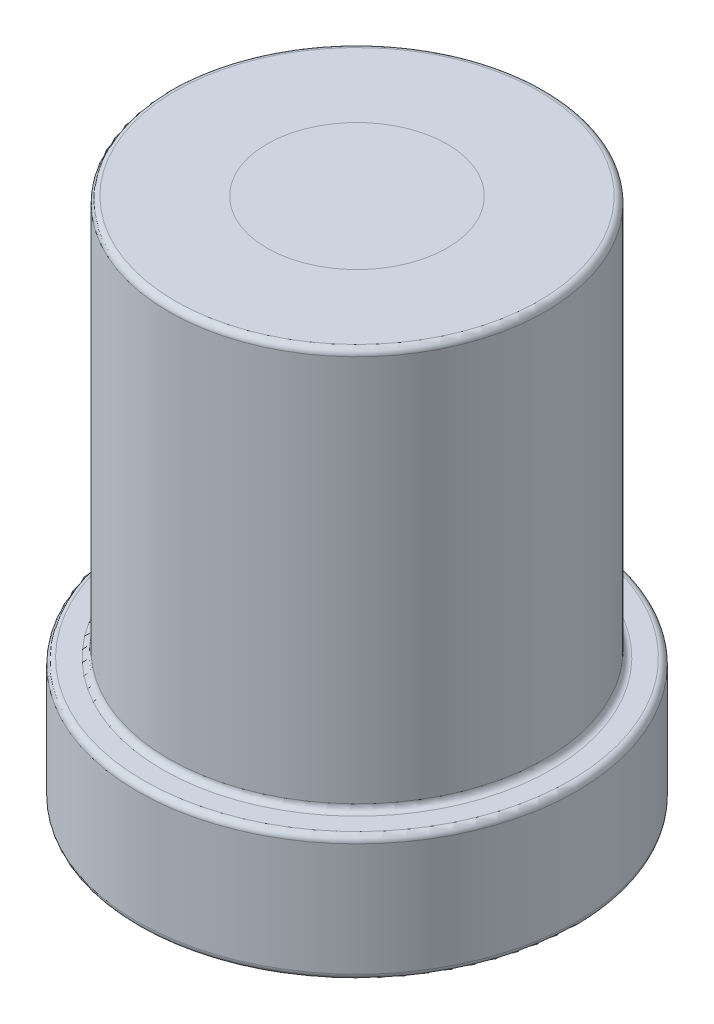
ISO-10303-21;
HEADER;
FILE_DESCRIPTION(('STEP AP214'),'2;1');
FILE_NAME('part.step','',(''),(''),'','','');
FILE_SCHEMA(('AUTOMOTIVE_DESIGN { 1 0 10303 214 1 1 1 1 }'));
ENDSEC;
DATA;
#1=APPLICATION_CONTEXT('core data for automotive mechanical design processes');
#2=APPLICATION_PROTOCOL_DEFINITION('international standard','automotive_design',2000,#1);
#3=PRODUCT_CONTEXT('',#1,'mechanical');
#4=PRODUCT('Part','Part','',(#3));
#5=PRODUCT_RELATED_PRODUCT_CATEGORY('part','',(#4));
#6=PRODUCT_DEFINITION_FORMATION('','',#4);
#7=PRODUCT_DEFINITION_CONTEXT('part definition',#1,'design');
#8=PRODUCT_DEFINITION('design','',#6,#7);
#9=PRODUCT_DEFINITION_SHAPE('','',#8);
#10=(LENGTH_UNIT() NAMED_UNIT(*) SI_UNIT(.MILLI.,.METRE.));
#11=(NAMED_UNIT(*) PLANE_ANGLE_UNIT() SI_UNIT($,.RADIAN.));
#12=(NAMED_UNIT(*) SI_UNIT($,.STERADIAN.) SOLID_ANGLE_UNIT());
#13=UNCERTAINTY_MEASURE_WITH_UNIT(LENGTH_MEASURE(1.E-05),#10,'distance_accuracy_value','');
#14=(GEOMETRIC_REPRESENTATION_CONTEXT(3) GLOBAL_UNCERTAINTY_ASSIGNED_CONTEXT((#13)) GLOBAL_UNIT_ASSIGNED_CONTEXT((#10,
#11,#12)) REPRESENTATION_CONTEXT('',''));
#15=CARTESIAN_POINT('',(0.,0.,0.));
#16=DIRECTION('',(0.,0.,1.));
#17=DIRECTION('',(1.,0.,0.));
#18=AXIS2_PLACEMENT_3D('',#15,#16,#17);
#19=CARTESIAN_POINT('',(0.,14.75,0.));
#20=DIRECTION('',(0.,1.,0.));
#21=DIRECTION('',(0.,0.,1.));
#22=AXIS2_PLACEMENT_3D('',#19,#20,#21);
#23=CYLINDRICAL_SURFACE('',#22,2.875);
#24=CARTESIAN_POINT('',(0.,14.75,0.));
#25=DIRECTION('',(0.,1.,0.));
#26=DIRECTION('',(0.,0.,1.));
#27=AXIS2_PLACEMENT_3D('',#24,#25,#26);
#28=CIRCLE('',#27,2.875);
#29=CARTESIAN_POINT('',(0.,14.75,2.875));
#30=VERTEX_POINT('',#29);
#31=EDGE_CURVE('E11',#30,#30,#28,.T.);
#32=ORIENTED_EDGE('',*,*,#31,.T.);
#33=EDGE_LOOP('',(#32));
#34=FACE_BOUND('',#33,.T.);
#35=CARTESIAN_POINT('',(0.,16.75,0.));
#36=DIRECTION('',(0.,1.,0.));
#37=DIRECTION('',(0.,0.,1.));
#38=AXIS2_PLACEMENT_3D('',#35,#36,#37);
#39=CIRCLE('',#38,2.875);
#40=CARTESIAN_POINT('',(0.,16.75,2.875));
#41=VERTEX_POINT('',#40);
#42=EDGE_CURVE('E44',#41,#41,#39,.T.);
#43=ORIENTED_EDGE('',*,*,#42,.F.);
#44=EDGE_LOOP('',(#43));
#45=FACE_BOUND('',#44,.T.);
#46=ADVANCED_FACE('F41',(#34,#45),#23,.T.);
#47=CARTESIAN_POINT('',(0.,14.75,0.));
#48=DIRECTION('',(0.,1.,0.));
#49=DIRECTION('',(0.,0.,1.));
#50=AXIS2_PLACEMENT_3D('',#47,#48,#49);
#51=PLANE('',#50);
#52=ORIENTED_EDGE('',*,*,#31,.F.);
#53=EDGE_LOOP('',(#52));
#54=FACE_BOUND('',#53,.T.);
#55=ADVANCED_FACE('F56',(#54),#51,.F.);
#56=CARTESIAN_POINT('',(0.,16.75,0.));
#57=DIRECTION('',(0.,1.,0.));
#58=DIRECTION('',(0.,0.,1.));
#59=AXIS2_PLACEMENT_3D('',#56,#57,#58);
#60=PLANE('',#59);
#61=ORIENTED_EDGE('',*,*,#42,.T.);
#62=EDGE_LOOP('',(#61));
#63=FACE_BOUND('',#62,.T.);
#64=ADVANCED_FACE('F53',(#63),#60,.T.);
#65=CLOSED_SHELL('',(#46,#55,#64));
#66=MANIFOLD_SOLID_BREP('B2',#65);
#67=CARTESIAN_POINT('',(0.,1.,0.));
#68=DIRECTION('',(0.,1.,0.));
#69=DIRECTION('',(0.,0.,1.));
#70=AXIS2_PLACEMENT_3D('',#67,#68,#69);
#71=CYLINDRICAL_SURFACE('',#70,4.4);
#72=CARTESIAN_POINT('',(0.,1.,0.));
#73=DIRECTION('',(0.,-1.,0.));
#74=DIRECTION('',(0.,0.,-1.));
#75=AXIS2_PLACEMENT_3D('',#72,#73,#74);
#76=CIRCLE('',#75,4.4);
#77=CARTESIAN_POINT('',(0.,1.,-4.4));
#78=VERTEX_POINT('',#77);
#79=EDGE_CURVE('E40',#78,#78,#76,.T.);
#80=ORIENTED_EDGE('',*,*,#79,.F.);
#81=EDGE_LOOP('',(#80));
#82=FACE_BOUND('',#81,.T.);
#83=CARTESIAN_POINT('',(0.,3.,0.));
#84=DIRECTION('',(0.,-1.,0.));
#85=DIRECTION('',(0.,0.,-1.));
#86=AXIS2_PLACEMENT_3D('',#83,#84,#85);
#87=CIRCLE('',#86,4.4);
#88=CARTESIAN_POINT('',(0.,3.,-4.4));
#89=VERTEX_POINT('',#88);
#90=EDGE_CURVE('E95',#89,#89,#87,.T.);
#91=ORIENTED_EDGE('',*,*,#90,.T.);
#92=EDGE_LOOP('',(#91));
#93=FACE_BOUND('',#92,.T.);
#94=ADVANCED_FACE('F88',(#82,#93),#71,.T.);
#95=CARTESIAN_POINT('',(0.,20.11,0.));
#96=DIRECTION('',(0.,0.,1.));
#97=DIRECTION('',(1.,0.,0.));
#98=AXIS2_PLACEMENT_3D('',#95,#96,#97);
#99=SPHERICAL_SURFACE('',#98,19.61);
#100=CARTESIAN_POINT('',(0.,20.11,0.));
#101=DIRECTION('',(0.,-1.,0.));
#102=DIRECTION('',(0.,0.,-1.));
#103=AXIS2_PLACEMENT_3D('',#100,#101,#102);
#104=SPHERICAL_SURFACE('',#103,19.61);
#105=ORIENTED_EDGE('',*,*,#79,.T.);
#106=EDGE_LOOP('',(#105));
#107=FACE_BOUND('',#106,.T.);
#108=ADVANCED_FACE('F90',(#107),#104,.T.);
#109=CARTESIAN_POINT('',(0.,3.,0.));
#110=DIRECTION('',(0.,-1.,0.));
#111=DIRECTION('',(0.,0.,-1.));
#112=AXIS2_PLACEMENT_3D('',#109,#110,#111);
#113=PLANE('',#112);
#114=ORIENTED_EDGE('',*,*,#90,.F.);
#115=EDGE_LOOP('',(#114));
#116=FACE_BOUND('',#115,.T.);
#117=ADVANCED_FACE('F102',(#116),#113,.F.);
#118=CLOSED_SHELL('',(#94,#108,#117));
#119=MANIFOLD_SOLID_BREP('B6',#118);
#120=CARTESIAN_POINT('',(0.,0.,0.));
#121=DIRECTION('',(0.,1.,0.));
#122=DIRECTION('',(0.,0.,1.));
#123=AXIS2_PLACEMENT_3D('',#120,#121,#122);
#124=CYLINDRICAL_SURFACE('',#123,2.875);
#125=CARTESIAN_POINT('',(0.,16.75,0.));
#126=DIRECTION('',(0.,1.,0.));
#127=DIRECTION('',(0.,0.,1.));
#128=AXIS2_PLACEMENT_3D('',#125,#126,#127);
#129=CIRCLE('',#128,2.875);
#130=CARTESIAN_POINT('',(0.,16.75,2.875));
#131=VERTEX_POINT('',#130);
#132=EDGE_CURVE('E172',#131,#131,#129,.T.);
#133=ORIENTED_EDGE('',*,*,#132,.T.);
#134=EDGE_LOOP('',(#133));
#135=FACE_BOUND('',#134,.T.);
#136=CARTESIAN_POINT('',(0.,3.,0.));
#137=DIRECTION('',(0.,-1.,0.));
#138=DIRECTION('',(0.,0.,-1.));
#139=AXIS2_PLACEMENT_3D('',#136,#137,#138);
#140=CIRCLE('',#139,2.875);
#141=CARTESIAN_POINT('',(0.,3.,-2.875));
#142=VERTEX_POINT('',#141);
#143=EDGE_CURVE('E173',#142,#142,#140,.F.);
#144=ORIENTED_EDGE('',*,*,#143,.F.);
#145=EDGE_LOOP('',(#144));
#146=FACE_BOUND('',#145,.T.);
#147=ADVANCED_FACE('F128',(#135,#146),#124,.F.);
#148=CARTESIAN_POINT('',(0.,4.,0.));
#149=DIRECTION('',(0.,-1.,0.));
#150=DIRECTION('',(0.,0.,-1.));
#151=AXIS2_PLACEMENT_3D('',#148,#149,#150);
#152=CYLINDRICAL_SURFACE('',#151,7.);
#153=CARTESIAN_POINT('',(0.,3.8,0.));
#154=DIRECTION('',(0.,1.,0.));
#155=DIRECTION('',(0.,0.,1.));
#156=AXIS2_PLACEMENT_3D('',#153,#154,#155);
#157=CIRCLE('',#156,7.);
#158=CARTESIAN_POINT('',(0.,3.8,7.));
#159=VERTEX_POINT('',#158);
#160=EDGE_CURVE('E87',#159,#159,#157,.F.);
#161=ORIENTED_EDGE('',*,*,#160,.T.);
#162=EDGE_LOOP('',(#161));
#163=FACE_BOUND('',#162,.T.);
#164=CARTESIAN_POINT('',(0.,0.2,0.));
#165=DIRECTION('',(0.,1.,0.));
#166=DIRECTION('',(0.,0.,1.));
#167=AXIS2_PLACEMENT_3D('',#164,#165,#166);
#168=CIRCLE('',#167,7.);
#169=CARTESIAN_POINT('',(0.,0.2,7.));
#170=VERTEX_POINT('',#169);
#171=EDGE_CURVE('E135',#170,#170,#168,.T.);
#172=ORIENTED_EDGE('',*,*,#171,.T.);
#173=EDGE_LOOP('',(#172));
#174=FACE_BOUND('',#173,.T.);
#175=ADVANCED_FACE('F201',(#163,#174),#152,.T.);
#176=CARTESIAN_POINT('',(0.,4.,0.));
#177=DIRECTION('',(0.,1.,0.));
#178=DIRECTION('',(0.,0.,1.));
#179=AXIS2_PLACEMENT_3D('',#176,#177,#178);
#180=PLANE('',#179);
#181=CARTESIAN_POINT('',(0.,4.,0.));
#182=DIRECTION('',(0.,1.,0.));
#183=DIRECTION('',(0.,0.,1.));
#184=AXIS2_PLACEMENT_3D('',#181,#182,#183);
#185=CIRCLE('',#184,6.2);
#186=CARTESIAN_POINT('',(0.,4.,6.2));
#187=VERTEX_POINT('',#186);
#188=EDGE_CURVE('E139',#187,#187,#185,.F.);
#189=ORIENTED_EDGE('',*,*,#188,.T.);
#190=EDGE_LOOP('',(#189));
#191=FACE_BOUND('',#190,.T.);
#192=CARTESIAN_POINT('',(0.,4.,0.));
#193=DIRECTION('',(0.,1.,0.));
#194=DIRECTION('',(0.,0.,1.));
#195=AXIS2_PLACEMENT_3D('',#192,#193,#194);
#196=CIRCLE('',#195,6.8);
#197=CARTESIAN_POINT('',(0.,4.,6.8));
#198=VERTEX_POINT('',#197);
#199=EDGE_CURVE('E143',#198,#198,#196,.T.);
#200=ORIENTED_EDGE('',*,*,#199,.T.);
#201=EDGE_LOOP('',(#200));
#202=FACE_BOUND('',#201,.T.);
#203=ADVANCED_FACE('F206',(#191,#202),#180,.T.);
#204=CARTESIAN_POINT('',(0.,0.,0.));
#205=DIRECTION('',(0.,1.,0.));
#206=DIRECTION('',(0.,0.,1.));
#207=AXIS2_PLACEMENT_3D('',#204,#205,#206);
#208=PLANE('',#207);
#209=CARTESIAN_POINT('',(0.,0.,0.));
#210=DIRECTION('',(0.,1.,0.));
#211=DIRECTION('',(0.,0.,1.));
#212=AXIS2_PLACEMENT_3D('',#209,#210,#211);
#213=CIRCLE('',#212,5.73713553108738);
#214=CARTESIAN_POINT('',(0.,0.,5.73713553108738));
#215=VERTEX_POINT('',#214);
#216=EDGE_CURVE('E166',#215,#215,#213,.T.);
#217=ORIENTED_EDGE('',*,*,#216,.T.);
#218=EDGE_LOOP('',(#217));
#219=FACE_BOUND('',#218,.T.);
#220=CARTESIAN_POINT('',(0.,0.,0.));
#221=DIRECTION('',(0.,1.,0.));
#222=DIRECTION('',(0.,0.,1.));
#223=AXIS2_PLACEMENT_3D('',#220,#221,#222);
#224=CIRCLE('',#223,6.8);
#225=CARTESIAN_POINT('',(0.,0.,6.8));
#226=VERTEX_POINT('',#225);
#227=EDGE_CURVE('E169',#226,#226,#224,.F.);
#228=ORIENTED_EDGE('',*,*,#227,.T.);
#229=EDGE_LOOP('',(#228));
#230=FACE_BOUND('',#229,.T.);
#231=ADVANCED_FACE('F216',(#219,#230),#208,.F.);
#232=CARTESIAN_POINT('',(0.,16.75,0.));
#233=DIRECTION('',(0.,-1.,0.));
#234=DIRECTION('',(0.,0.,-1.));
#235=AXIS2_PLACEMENT_3D('',#232,#233,#234);
#236=CYLINDRICAL_SURFACE('',#235,6.);
#237=CARTESIAN_POINT('',(0.,16.55,0.));
#238=DIRECTION('',(0.,1.,0.));
#239=DIRECTION('',(0.,0.,1.));
#240=AXIS2_PLACEMENT_3D('',#237,#238,#239);
#241=CIRCLE('',#240,6.);
#242=CARTESIAN_POINT('',(0.,16.55,6.));
#243=VERTEX_POINT('',#242);
#244=EDGE_CURVE('E148',#243,#243,#241,.F.);
#245=ORIENTED_EDGE('',*,*,#244,.T.);
#246=EDGE_LOOP('',(#245));
#247=FACE_BOUND('',#246,.T.);
#248=CARTESIAN_POINT('',(0.,4.2,0.));
#249=DIRECTION('',(0.,1.,0.));
#250=DIRECTION('',(0.,0.,1.));
#251=AXIS2_PLACEMENT_3D('',#248,#249,#250);
#252=CIRCLE('',#251,6.);
#253=CARTESIAN_POINT('',(0.,4.2,6.));
#254=VERTEX_POINT('',#253);
#255=EDGE_CURVE('E151',#254,#254,#252,.T.);
#256=ORIENTED_EDGE('',*,*,#255,.T.);
#257=EDGE_LOOP('',(#256));
#258=FACE_BOUND('',#257,.T.);
#259=ADVANCED_FACE('F212',(#247,#258),#236,.T.);
#260=CARTESIAN_POINT('',(0.,16.75,0.));
#261=DIRECTION('',(0.,1.,0.));
#262=DIRECTION('',(0.,0.,1.));
#263=AXIS2_PLACEMENT_3D('',#260,#261,#262);
#264=PLANE('',#263);
#265=CARTESIAN_POINT('',(0.,16.75,0.));
#266=DIRECTION('',(0.,1.,0.));
#267=DIRECTION('',(0.,0.,1.));
#268=AXIS2_PLACEMENT_3D('',#265,#266,#267);
#269=CIRCLE('',#268,5.8);
#270=CARTESIAN_POINT('',(0.,16.75,5.8));
#271=VERTEX_POINT('',#270);
#272=EDGE_CURVE('E154',#271,#271,#269,.T.);
#273=ORIENTED_EDGE('',*,*,#272,.T.);
#274=EDGE_LOOP('',(#273));
#275=FACE_BOUND('',#274,.T.);
#276=ORIENTED_EDGE('',*,*,#132,.F.);
#277=EDGE_LOOP('',(#276));
#278=FACE_BOUND('',#277,.T.);
#279=ADVANCED_FACE('F197',(#275,#278),#264,.T.);
#280=CARTESIAN_POINT('',(0.,3.,0.));
#281=DIRECTION('',(0.,-1.,0.));
#282=DIRECTION('',(0.,0.,-1.));
#283=AXIS2_PLACEMENT_3D('',#280,#281,#282);
#284=PLANE('',#283);
#285=CARTESIAN_POINT('',(0.,3.,0.));
#286=DIRECTION('',(0.,-1.,0.));
#287=DIRECTION('',(0.,0.,-1.));
#288=AXIS2_PLACEMENT_3D('',#285,#286,#287);
#289=CIRCLE('',#288,4.4);
#290=CARTESIAN_POINT('',(0.,3.,-4.4));
#291=VERTEX_POINT('',#290);
#292=EDGE_CURVE('E176',#291,#291,#289,.T.);
#293=ORIENTED_EDGE('',*,*,#292,.T.);
#294=EDGE_LOOP('',(#293));
#295=FACE_BOUND('',#294,.T.);
#296=ORIENTED_EDGE('',*,*,#143,.T.);
#297=EDGE_LOOP('',(#296));
#298=FACE_BOUND('',#297,.T.);
#299=ADVANCED_FACE('F182',(#295,#298),#284,.T.);
#300=CARTESIAN_POINT('',(0.,3.,0.));
#301=DIRECTION('',(0.,-1.,0.));
#302=DIRECTION('',(0.,0.,-1.));
#303=AXIS2_PLACEMENT_3D('',#300,#301,#302);
#304=CYLINDRICAL_SURFACE('',#303,4.4);
#305=CARTESIAN_POINT('',(0.,0.637359819648987,0.));
#306=DIRECTION('',(0.,1.,0.));
#307=DIRECTION('',(0.,0.,1.));
#308=AXIS2_PLACEMENT_3D('',#305,#306,#307);
#309=CIRCLE('',#308,4.4);
#310=CARTESIAN_POINT('',(0.,0.637359819648987,4.4));
#311=VERTEX_POINT('',#310);
#312=EDGE_CURVE('E157',#311,#311,#309,.F.);
#313=ORIENTED_EDGE('',*,*,#312,.T.);
#314=EDGE_LOOP('',(#313));
#315=FACE_BOUND('',#314,.T.);
#316=ORIENTED_EDGE('',*,*,#292,.F.);
#317=EDGE_LOOP('',(#316));
#318=FACE_BOUND('',#317,.T.);
#319=ADVANCED_FACE('F185',(#315,#318),#304,.F.);
#320=CARTESIAN_POINT('',(0.,0.5,0.));
#321=DIRECTION('',(0.,-1.,0.));
#322=DIRECTION('',(0.,0.,-1.));
#323=AXIS2_PLACEMENT_3D('',#320,#321,#322);
#324=CONICAL_SURFACE('',#323,4.4,1.20362249297668);
#325=CARTESIAN_POINT('',(0.,0.0133308787593871,0.));
#326=DIRECTION('',(0.,-1.,0.));
#327=DIRECTION('',(0.,0.,-1.));
#328=AXIS2_PLACEMENT_3D('',#325,#326,#327);
#329=CIRCLE('',#328,5.6653397152256);
#330=CARTESIAN_POINT('',(0.,0.0133308787593871,-5.6653397152256));
#331=VERTEX_POINT('',#330);
#332=EDGE_CURVE('E160',#331,#331,#329,.T.);
#333=ORIENTED_EDGE('',*,*,#332,.T.);
#334=EDGE_LOOP('',(#333));
#335=FACE_BOUND('',#334,.T.);
#336=CARTESIAN_POINT('',(0.,0.450690698408375,0.));
#337=DIRECTION('',(0.,-1.,0.));
#338=DIRECTION('',(0.,0.,-1.));
#339=AXIS2_PLACEMENT_3D('',#336,#337,#338);
#340=CIRCLE('',#339,4.52820418413823);
#341=CARTESIAN_POINT('',(0.,0.450690698408375,-4.52820418413823));
#342=VERTEX_POINT('',#341);
#343=EDGE_CURVE('E163',#342,#342,#340,.F.);
#344=ORIENTED_EDGE('',*,*,#343,.T.);
#345=EDGE_LOOP('',(#344));
#346=FACE_BOUND('',#345,.T.);
#347=ADVANCED_FACE('F187',(#335,#346),#324,.F.);
#348=CARTESIAN_POINT('',(0.,0.2,0.));
#349=DIRECTION('',(0.,1.,0.));
#350=DIRECTION('',(0.,0.,1.));
#351=AXIS2_PLACEMENT_3D('',#348,#349,#350);
#352=TOROIDAL_SURFACE('',#351,5.73713553108738,0.2);
#353=ORIENTED_EDGE('',*,*,#332,.F.);
#354=EDGE_LOOP('',(#353));
#355=FACE_BOUND('',#354,.T.);
#356=ORIENTED_EDGE('',*,*,#216,.F.);
#357=EDGE_LOOP('',(#356));
#358=FACE_BOUND('',#357,.T.);
#359=ADVANCED_FACE('F194',(#355,#358),#352,.T.);
#360=CARTESIAN_POINT('',(0.,0.637359819648987,0.));
#361=DIRECTION('',(0.,1.,0.));
#362=DIRECTION('',(0.,0.,1.));
#363=AXIS2_PLACEMENT_3D('',#360,#361,#362);
#364=TOROIDAL_SURFACE('',#363,4.6,0.2);
#365=ORIENTED_EDGE('',*,*,#343,.F.);
#366=EDGE_LOOP('',(#365));
#367=FACE_BOUND('',#366,.T.);
#368=ORIENTED_EDGE('',*,*,#312,.F.);
#369=EDGE_LOOP('',(#368));
#370=FACE_BOUND('',#369,.T.);
#371=ADVANCED_FACE('F226',(#367,#370),#364,.T.);
#372=CARTESIAN_POINT('',(0.,16.55,0.));
#373=DIRECTION('',(0.,1.,0.));
#374=DIRECTION('',(0.,0.,1.));
#375=AXIS2_PLACEMENT_3D('',#372,#373,#374);
#376=TOROIDAL_SURFACE('',#375,5.8,0.2);
#377=ORIENTED_EDGE('',*,*,#244,.F.);
#378=EDGE_LOOP('',(#377));
#379=FACE_BOUND('',#378,.T.);
#380=ORIENTED_EDGE('',*,*,#272,.F.);
#381=EDGE_LOOP('',(#380));
#382=FACE_BOUND('',#381,.T.);
#383=ADVANCED_FACE('F230',(#379,#382),#376,.T.);
#384=CARTESIAN_POINT('',(0.,4.2,0.));
#385=DIRECTION('',(0.,1.,0.));
#386=DIRECTION('',(0.,0.,1.));
#387=AXIS2_PLACEMENT_3D('',#384,#385,#386);
#388=TOROIDAL_SURFACE('',#387,6.2,0.2);
#389=ORIENTED_EDGE('',*,*,#188,.F.);
#390=EDGE_LOOP('',(#389));
#391=FACE_BOUND('',#390,.T.);
#392=ORIENTED_EDGE('',*,*,#255,.F.);
#393=EDGE_LOOP('',(#392));
#394=FACE_BOUND('',#393,.T.);
#395=ADVANCED_FACE('F234',(#391,#394),#388,.F.);
#396=CARTESIAN_POINT('',(0.,3.8,0.));
#397=DIRECTION('',(0.,1.,0.));
#398=DIRECTION('',(0.,0.,1.));
#399=AXIS2_PLACEMENT_3D('',#396,#397,#398);
#400=TOROIDAL_SURFACE('',#399,6.8,0.2);
#401=ORIENTED_EDGE('',*,*,#160,.F.);
#402=EDGE_LOOP('',(#401));
#403=FACE_BOUND('',#402,.T.);
#404=ORIENTED_EDGE('',*,*,#199,.F.);
#405=EDGE_LOOP('',(#404));
#406=FACE_BOUND('',#405,.T.);
#407=ADVANCED_FACE('F237',(#403,#406),#400,.T.);
#408=CARTESIAN_POINT('',(0.,0.2,0.));
#409=DIRECTION('',(0.,1.,0.));
#410=DIRECTION('',(0.,0.,1.));
#411=AXIS2_PLACEMENT_3D('',#408,#409,#410);
#412=TOROIDAL_SURFACE('',#411,6.8,0.2);
#413=ORIENTED_EDGE('',*,*,#227,.F.);
#414=EDGE_LOOP('',(#413));
#415=FACE_BOUND('',#414,.T.);
#416=ORIENTED_EDGE('',*,*,#171,.F.);
#417=EDGE_LOOP('',(#416));
#418=FACE_BOUND('',#417,.T.);
#419=ADVANCED_FACE('F130',(#415,#418),#412,.T.);
#420=CLOSED_SHELL('',(#147,#175,#203,#231,#259,#279,#299,#319,#347,#359,#371,#383,#395,#407,#419));
#421=MANIFOLD_SOLID_BREP('B35',#420);
#422=ADVANCED_BREP_SHAPE_REPRESENTATION('',(#18,#66,#119,#421),#14);
#423=SHAPE_DEFINITION_REPRESENTATION(#9,#422);
ENDSEC;
END-ISO-10303-21;
